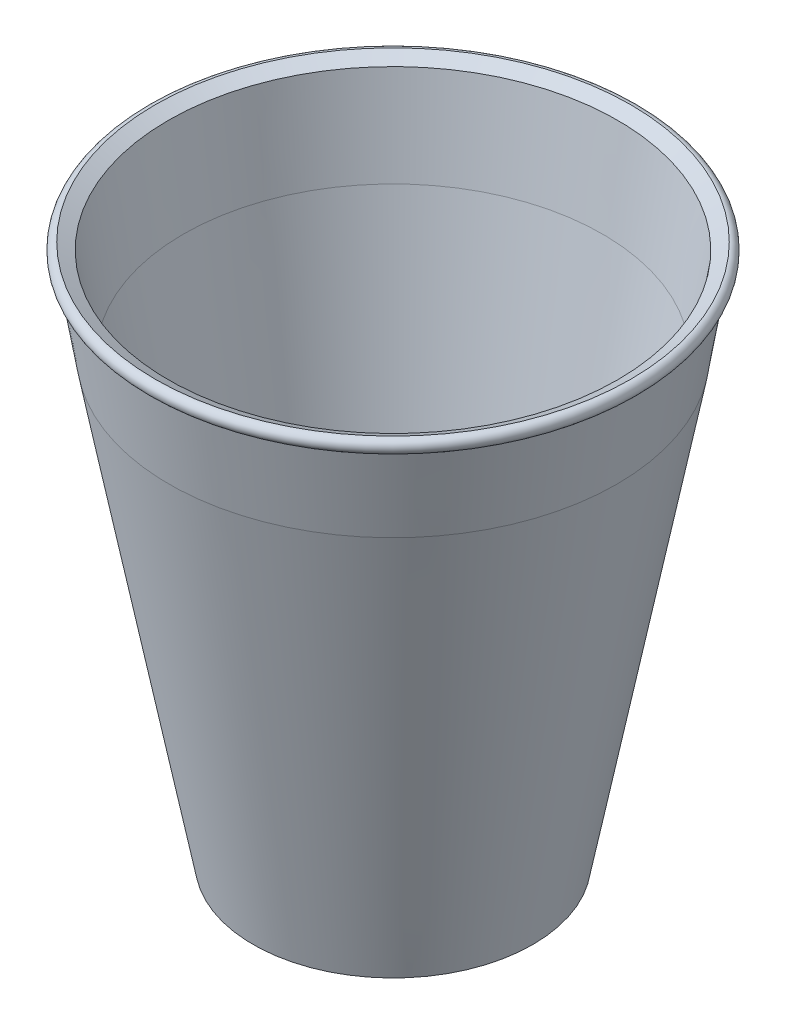
ISO-10303-21;
HEADER;
FILE_DESCRIPTION(('STEP AP214'),'2;1');
FILE_NAME('part.step','',(''),(''),'','','');
FILE_SCHEMA(('AUTOMOTIVE_DESIGN { 1 0 10303 214 1 1 1 1 }'));
ENDSEC;
DATA;
#1=APPLICATION_CONTEXT('core data for automotive mechanical design processes');
#2=APPLICATION_PROTOCOL_DEFINITION('international standard','automotive_design',2000,#1);
#3=PRODUCT_CONTEXT('',#1,'mechanical');
#4=PRODUCT('Part','Part','',(#3));
#5=PRODUCT_RELATED_PRODUCT_CATEGORY('part','',(#4));
#6=PRODUCT_DEFINITION_FORMATION('','',#4);
#7=PRODUCT_DEFINITION_CONTEXT('part definition',#1,'design');
#8=PRODUCT_DEFINITION('design','',#6,#7);
#9=PRODUCT_DEFINITION_SHAPE('','',#8);
#10=(LENGTH_UNIT() NAMED_UNIT(*) SI_UNIT(.MILLI.,.METRE.));
#11=(NAMED_UNIT(*) PLANE_ANGLE_UNIT() SI_UNIT($,.RADIAN.));
#12=(NAMED_UNIT(*) SI_UNIT($,.STERADIAN.) SOLID_ANGLE_UNIT());
#13=UNCERTAINTY_MEASURE_WITH_UNIT(LENGTH_MEASURE(1.E-05),#10,'distance_accuracy_value','');
#14=(GEOMETRIC_REPRESENTATION_CONTEXT(3) GLOBAL_UNCERTAINTY_ASSIGNED_CONTEXT((#13)) GLOBAL_UNIT_ASSIGNED_CONTEXT((#10,
#11,#12)) REPRESENTATION_CONTEXT('',''));
#15=CARTESIAN_POINT('',(0.,0.,0.));
#16=DIRECTION('',(0.,0.,1.));
#17=DIRECTION('',(1.,0.,0.));
#18=AXIS2_PLACEMENT_3D('',#15,#16,#17);
#19=CARTESIAN_POINT('',(-12.6,-75.2,0.));
#20=DIRECTION('',(0.,-1.,0.));
#21=DIRECTION('',(1.,0.,0.));
#22=AXIS2_PLACEMENT_3D('',#19,#20,#21);
#23=PLANE('',#22);
#24=CARTESIAN_POINT('',(0.,-75.2,0.));
#25=DIRECTION('',(0.,1.,0.));
#26=DIRECTION('',(-1.,0.,0.));
#27=AXIS2_PLACEMENT_3D('',#24,#25,#26);
#28=CIRCLE('',#27,12.6);
#29=CARTESIAN_POINT('',(-12.6,-75.2,0.));
#30=VERTEX_POINT('',#29);
#31=EDGE_CURVE('E10',#30,#30,#28,.T.);
#32=ORIENTED_EDGE('',*,*,#31,.F.);
#33=EDGE_LOOP('',(#32));
#34=FACE_BOUND('',#33,.T.);
#35=ADVANCED_FACE('F37',(#34),#23,.T.);
#36=CARTESIAN_POINT('',(0.,0.,0.));
#37=DIRECTION('',(0.,1.,0.));
#38=DIRECTION('',(-1.,0.,0.));
#39=AXIS2_PLACEMENT_3D('',#36,#37,#38);
#40=CYLINDRICAL_SURFACE('',#39,12.6);
#41=ORIENTED_EDGE('',*,*,#31,.T.);
#42=EDGE_LOOP('',(#41));
#43=FACE_BOUND('',#42,.T.);
#44=CARTESIAN_POINT('',(0.,-76.6,0.));
#45=DIRECTION('',(0.,1.,0.));
#46=DIRECTION('',(-1.,0.,0.));
#47=AXIS2_PLACEMENT_3D('',#44,#45,#46);
#48=CIRCLE('',#47,12.6);
#49=CARTESIAN_POINT('',(-12.6,-76.6,0.));
#50=VERTEX_POINT('',#49);
#51=EDGE_CURVE('E43',#50,#50,#48,.T.);
#52=ORIENTED_EDGE('',*,*,#51,.F.);
#53=EDGE_LOOP('',(#52));
#54=FACE_BOUND('',#53,.T.);
#55=ADVANCED_FACE('F97',(#43,#54),#40,.F.);
#56=CARTESIAN_POINT('',(-12.3850781059358,-76.6,0.));
#57=DIRECTION('',(0.,1.,0.));
#58=DIRECTION('',(-1.,0.,0.));
#59=AXIS2_PLACEMENT_3D('',#56,#57,#58);
#60=PLANE('',#59);
#61=ORIENTED_EDGE('',*,*,#51,.T.);
#62=EDGE_LOOP('',(#61));
#63=FACE_BOUND('',#62,.T.);
#64=CARTESIAN_POINT('',(0.,-76.6,0.));
#65=DIRECTION('',(0.,1.,0.));
#66=DIRECTION('',(-1.,0.,0.));
#67=AXIS2_PLACEMENT_3D('',#64,#65,#66);
#68=CIRCLE('',#67,12.3850781059358);
#69=CARTESIAN_POINT('',(-12.3850781059358,-76.6,0.));
#70=VERTEX_POINT('',#69);
#71=EDGE_CURVE('E47',#70,#70,#68,.T.);
#72=ORIENTED_EDGE('',*,*,#71,.F.);
#73=EDGE_LOOP('',(#72));
#74=FACE_BOUND('',#73,.T.);
#75=ADVANCED_FACE('F102',(#63,#74),#60,.T.);
#76=CARTESIAN_POINT('',(0.,-76.7,0.));
#77=DIRECTION('',(0.,1.,0.));
#78=DIRECTION('',(-1.,0.,0.));
#79=AXIS2_PLACEMENT_3D('',#76,#77,#78);
#80=TOROIDAL_SURFACE('',#79,12.3850781059358,0.0999999999999989);
#81=ORIENTED_EDGE('',*,*,#71,.T.);
#82=EDGE_LOOP('',(#81));
#83=FACE_BOUND('',#82,.T.);
#84=CARTESIAN_POINT('',(0.,-76.7780868809443,0.));
#85=DIRECTION('',(0.,1.,0.));
#86=DIRECTION('',(-1.,0.,0.));
#87=AXIS2_PLACEMENT_3D('',#84,#85,#86);
#88=CIRCLE('',#87,12.3226086011804);
#89=CARTESIAN_POINT('',(-12.3226086011804,-76.7780868809443,0.));
#90=VERTEX_POINT('',#89);
#91=EDGE_CURVE('E51',#90,#90,#88,.T.);
#92=ORIENTED_EDGE('',*,*,#91,.F.);
#93=EDGE_LOOP('',(#92));
#94=FACE_BOUND('',#93,.T.);
#95=ADVANCED_FACE('F106',(#83,#94),#80,.T.);
#96=CARTESIAN_POINT('',(0.,-77.,0.));
#97=DIRECTION('',(0.,-1.,0.));
#98=DIRECTION('',(1.,0.,0.));
#99=AXIS2_PLACEMENT_3D('',#96,#97,#98);
#100=CONICAL_SURFACE('',#99,12.6,0.896055384571353);
#101=ORIENTED_EDGE('',*,*,#91,.T.);
#102=EDGE_LOOP('',(#101));
#103=FACE_BOUND('',#102,.T.);
#104=CARTESIAN_POINT('',(0.,-77.,0.));
#105=DIRECTION('',(0.,1.,0.));
#106=DIRECTION('',(-1.,0.,0.));
#107=AXIS2_PLACEMENT_3D('',#104,#105,#106);
#108=CIRCLE('',#107,12.6);
#109=CARTESIAN_POINT('',(-12.6,-77.,0.));
#110=VERTEX_POINT('',#109);
#111=EDGE_CURVE('E56',#110,#110,#108,.T.);
#112=ORIENTED_EDGE('',*,*,#111,.F.);
#113=EDGE_LOOP('',(#112));
#114=FACE_BOUND('',#113,.T.);
#115=ADVANCED_FACE('F112',(#103,#114),#100,.F.);
#116=CARTESIAN_POINT('',(-20.,-77.,0.));
#117=DIRECTION('',(0.,-1.,0.));
#118=DIRECTION('',(1.,0.,0.));
#119=AXIS2_PLACEMENT_3D('',#116,#117,#118);
#120=PLANE('',#119);
#121=ORIENTED_EDGE('',*,*,#111,.T.);
#122=EDGE_LOOP('',(#121));
#123=FACE_BOUND('',#122,.T.);
#124=CARTESIAN_POINT('',(0.,-77.,0.));
#125=DIRECTION('',(0.,1.,0.));
#126=DIRECTION('',(-1.,0.,0.));
#127=AXIS2_PLACEMENT_3D('',#124,#125,#126);
#128=CIRCLE('',#127,20.);
#129=CARTESIAN_POINT('',(-20.,-77.,0.));
#130=VERTEX_POINT('',#129);
#131=EDGE_CURVE('E59',#130,#130,#128,.T.);
#132=ORIENTED_EDGE('',*,*,#131,.F.);
#133=EDGE_LOOP('',(#132));
#134=FACE_BOUND('',#133,.T.);
#135=ADVANCED_FACE('F116',(#123,#134),#120,.T.);
#136=CARTESIAN_POINT('',(0.,-14.,0.));
#137=DIRECTION('',(0.,1.,0.));
#138=DIRECTION('',(-1.,0.,0.));
#139=AXIS2_PLACEMENT_3D('',#136,#137,#138);
#140=CONICAL_SURFACE('',#139,32.,0.188221505304771);
#141=ORIENTED_EDGE('',*,*,#131,.T.);
#142=EDGE_LOOP('',(#141));
#143=FACE_BOUND('',#142,.T.);
#144=CARTESIAN_POINT('',(0.,-14.,0.));
#145=DIRECTION('',(0.,1.,0.));
#146=DIRECTION('',(-1.,0.,0.));
#147=AXIS2_PLACEMENT_3D('',#144,#145,#146);
#148=CIRCLE('',#147,32.);
#149=CARTESIAN_POINT('',(-32.,-14.,0.));
#150=VERTEX_POINT('',#149);
#151=EDGE_CURVE('E62',#150,#150,#148,.T.);
#152=ORIENTED_EDGE('',*,*,#151,.F.);
#153=EDGE_LOOP('',(#152));
#154=FACE_BOUND('',#153,.T.);
#155=ADVANCED_FACE('F120',(#143,#154),#140,.T.);
#156=CARTESIAN_POINT('',(0.,-2.,0.));
#157=DIRECTION('',(0.,1.,0.));
#158=DIRECTION('',(-1.,0.,0.));
#159=AXIS2_PLACEMENT_3D('',#156,#157,#158);
#160=CONICAL_SURFACE('',#159,34.,0.165148677414627);
#161=ORIENTED_EDGE('',*,*,#151,.T.);
#162=EDGE_LOOP('',(#161));
#163=FACE_BOUND('',#162,.T.);
#164=CARTESIAN_POINT('',(0.,-2.,0.));
#165=DIRECTION('',(0.,1.,0.));
#166=DIRECTION('',(-1.,0.,0.));
#167=AXIS2_PLACEMENT_3D('',#164,#165,#166);
#168=CIRCLE('',#167,34.);
#169=CARTESIAN_POINT('',(-34.,-2.,0.));
#170=VERTEX_POINT('',#169);
#171=EDGE_CURVE('E65',#170,#170,#168,.T.);
#172=ORIENTED_EDGE('',*,*,#171,.F.);
#173=EDGE_LOOP('',(#172));
#174=FACE_BOUND('',#173,.T.);
#175=ADVANCED_FACE('F124',(#163,#174),#160,.T.);
#176=CARTESIAN_POINT('',(0.,-0.999999999999996,0.));
#177=DIRECTION('',(0.,1.,0.));
#178=DIRECTION('',(-1.,0.,0.));
#179=AXIS2_PLACEMENT_3D('',#176,#177,#178);
#180=TOROIDAL_SURFACE('',#179,34.,1.);
#181=ORIENTED_EDGE('',*,*,#171,.T.);
#182=EDGE_LOOP('',(#181));
#183=FACE_BOUND('',#182,.T.);
#184=CARTESIAN_POINT('',(0.,0.,0.));
#185=DIRECTION('',(0.,1.,0.));
#186=DIRECTION('',(-1.,0.,0.));
#187=AXIS2_PLACEMENT_3D('',#184,#185,#186);
#188=CIRCLE('',#187,34.);
#189=CARTESIAN_POINT('',(-34.,0.,0.));
#190=VERTEX_POINT('',#189);
#191=EDGE_CURVE('E68',#190,#190,#188,.T.);
#192=ORIENTED_EDGE('',*,*,#191,.F.);
#193=EDGE_LOOP('',(#192));
#194=FACE_BOUND('',#193,.T.);
#195=ADVANCED_FACE('F128',(#183,#194),#180,.T.);
#196=CARTESIAN_POINT('',(0.,-0.999999999999995,0.));
#197=DIRECTION('',(0.,1.,0.));
#198=DIRECTION('',(-1.,0.,0.));
#199=AXIS2_PLACEMENT_3D('',#196,#197,#198);
#200=CONICAL_SURFACE('',#199,32.130708730816,1.07957178018462);
#201=ORIENTED_EDGE('',*,*,#191,.T.);
#202=EDGE_LOOP('',(#201));
#203=FACE_BOUND('',#202,.T.);
#204=CARTESIAN_POINT('',(0.,-0.999999999999995,0.));
#205=DIRECTION('',(0.,1.,0.));
#206=DIRECTION('',(-1.,0.,0.));
#207=AXIS2_PLACEMENT_3D('',#204,#205,#206);
#208=CIRCLE('',#207,32.130708730816);
#209=CARTESIAN_POINT('',(-32.130708730816,-0.999999999999999,0.));
#210=VERTEX_POINT('',#209);
#211=EDGE_CURVE('E71',#210,#210,#208,.T.);
#212=ORIENTED_EDGE('',*,*,#211,.F.);
#213=EDGE_LOOP('',(#212));
#214=FACE_BOUND('',#213,.T.);
#215=ADVANCED_FACE('F93',(#203,#214),#200,.F.);
#216=CARTESIAN_POINT('',(0.,-14.,0.));
#217=DIRECTION('',(0.,1.,0.));
#218=DIRECTION('',(-1.,0.,0.));
#219=AXIS2_PLACEMENT_3D('',#216,#217,#218);
#220=CONICAL_SURFACE('',#219,29.9640420641493,0.165148677414627);
#221=ORIENTED_EDGE('',*,*,#211,.T.);
#222=EDGE_LOOP('',(#221));
#223=FACE_BOUND('',#222,.T.);
#224=CARTESIAN_POINT('',(0.,-14.,0.));
#225=DIRECTION('',(0.,1.,0.));
#226=DIRECTION('',(-1.,0.,0.));
#227=AXIS2_PLACEMENT_3D('',#224,#225,#226);
#228=CIRCLE('',#227,29.9640420641493);
#229=CARTESIAN_POINT('',(-29.9640420641493,-14.,0.));
#230=VERTEX_POINT('',#229);
#231=EDGE_CURVE('E74',#230,#230,#228,.T.);
#232=ORIENTED_EDGE('',*,*,#231,.F.);
#233=EDGE_LOOP('',(#232));
#234=FACE_BOUND('',#233,.T.);
#235=ADVANCED_FACE('F85',(#223,#234),#220,.F.);
#236=CARTESIAN_POINT('',(0.,-73.7,0.));
#237=DIRECTION('',(0.,1.,0.));
#238=DIRECTION('',(-1.,0.,0.));
#239=AXIS2_PLACEMENT_3D('',#236,#237,#238);
#240=CONICAL_SURFACE('',#239,18.5926134927208,0.188221505304771);
#241=ORIENTED_EDGE('',*,*,#231,.T.);
#242=EDGE_LOOP('',(#241));
#243=FACE_BOUND('',#242,.T.);
#244=CARTESIAN_POINT('',(0.,-73.7,0.));
#245=DIRECTION('',(0.,1.,0.));
#246=DIRECTION('',(-1.,0.,0.));
#247=AXIS2_PLACEMENT_3D('',#244,#245,#246);
#248=CIRCLE('',#247,18.5926134927208);
#249=CARTESIAN_POINT('',(-18.5926134927208,-73.7,0.));
#250=VERTEX_POINT('',#249);
#251=EDGE_CURVE('E77',#250,#250,#248,.T.);
#252=ORIENTED_EDGE('',*,*,#251,.F.);
#253=EDGE_LOOP('',(#252));
#254=FACE_BOUND('',#253,.T.);
#255=ADVANCED_FACE('F83',(#243,#254),#240,.F.);
#256=CARTESIAN_POINT('',(0.,-73.7,0.));
#257=DIRECTION('',(0.,1.,0.));
#258=DIRECTION('',(-1.,0.,0.));
#259=AXIS2_PLACEMENT_3D('',#256,#257,#258);
#260=PLANE('',#259);
#261=ORIENTED_EDGE('',*,*,#251,.T.);
#262=EDGE_LOOP('',(#261));
#263=FACE_BOUND('',#262,.T.);
#264=ADVANCED_FACE('F81',(#263),#260,.T.);
#265=CLOSED_SHELL('',(#35,#55,#75,#95,#115,#135,#155,#175,#195,#215,#235,#255,#264));
#266=MANIFOLD_SOLID_BREP('B2',#265);
#267=ADVANCED_BREP_SHAPE_REPRESENTATION('',(#18,#266),#14);
#268=SHAPE_DEFINITION_REPRESENTATION(#9,#267);
ENDSEC;
END-ISO-10303-21;
